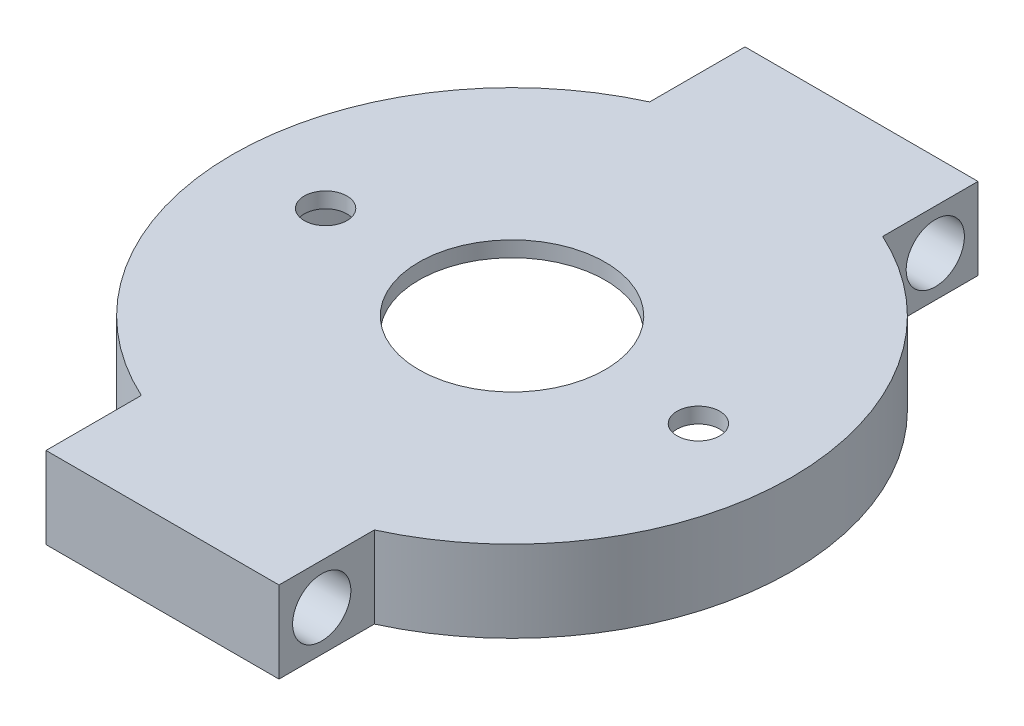
ISO-10303-21;
HEADER;
FILE_DESCRIPTION(('STEP AP214'),'2;1');
FILE_NAME('part.step','',(''),(''),'','','');
FILE_SCHEMA(('AUTOMOTIVE_DESIGN { 1 0 10303 214 1 1 1 1 }'));
ENDSEC;
DATA;
#1=APPLICATION_CONTEXT('core data for automotive mechanical design processes');
#2=APPLICATION_PROTOCOL_DEFINITION('international standard','automotive_design',2000,#1);
#3=PRODUCT_CONTEXT('',#1,'mechanical');
#4=PRODUCT('Part','Part','',(#3));
#5=PRODUCT_RELATED_PRODUCT_CATEGORY('part','',(#4));
#6=PRODUCT_DEFINITION_FORMATION('','',#4);
#7=PRODUCT_DEFINITION_CONTEXT('part definition',#1,'design');
#8=PRODUCT_DEFINITION('design','',#6,#7);
#9=PRODUCT_DEFINITION_SHAPE('','',#8);
#10=(LENGTH_UNIT() NAMED_UNIT(*) SI_UNIT(.MILLI.,.METRE.));
#11=(NAMED_UNIT(*) PLANE_ANGLE_UNIT() SI_UNIT($,.RADIAN.));
#12=(NAMED_UNIT(*) SI_UNIT($,.STERADIAN.) SOLID_ANGLE_UNIT());
#13=UNCERTAINTY_MEASURE_WITH_UNIT(LENGTH_MEASURE(1.E-05),#10,'distance_accuracy_value','');
#14=(GEOMETRIC_REPRESENTATION_CONTEXT(3) GLOBAL_UNCERTAINTY_ASSIGNED_CONTEXT((#13)) GLOBAL_UNIT_ASSIGNED_CONTEXT((#10,
#11,#12)) REPRESENTATION_CONTEXT('',''));
#15=CARTESIAN_POINT('',(0.,0.,0.));
#16=DIRECTION('',(0.,0.,1.));
#17=DIRECTION('',(1.,0.,0.));
#18=AXIS2_PLACEMENT_3D('',#15,#16,#17);
#19=CARTESIAN_POINT('',(0.,13.335,0.));
#20=DIRECTION('',(0.,-1.,0.));
#21=DIRECTION('',(0.,0.,-1.));
#22=AXIS2_PLACEMENT_3D('',#19,#20,#21);
#23=CYLINDRICAL_SURFACE('',#22,39.37);
#24=CARTESIAN_POINT('',(0.,0.,0.));
#25=DIRECTION('',(0.,1.,0.));
#26=DIRECTION('',(0.,0.,1.));
#27=AXIS2_PLACEMENT_3D('',#24,#25,#26);
#28=CIRCLE('',#27,39.37);
#29=CARTESIAN_POINT('',(0.,0.,39.37));
#30=VERTEX_POINT('',#29);
#31=EDGE_CURVE('E148',#30,#30,#28,.T.);
#32=ORIENTED_EDGE('',*,*,#31,.F.);
#33=EDGE_LOOP('',(#32));
#34=FACE_BOUND('',#33,.T.);
#35=CARTESIAN_POINT('',(0.,10.795,0.));
#36=DIRECTION('',(0.,1.,0.));
#37=DIRECTION('',(0.,0.,1.));
#38=AXIS2_PLACEMENT_3D('',#35,#36,#37);
#39=CIRCLE('',#38,39.37);
#40=CARTESIAN_POINT('',(0.,10.795,39.37));
#41=VERTEX_POINT('',#40);
#42=EDGE_CURVE('E199',#41,#41,#39,.T.);
#43=ORIENTED_EDGE('',*,*,#42,.T.);
#44=EDGE_LOOP('',(#43));
#45=FACE_BOUND('',#44,.T.);
#46=ADVANCED_FACE('F35',(#34,#45),#23,.F.);
#47=CARTESIAN_POINT('',(0.,13.335,0.));
#48=DIRECTION('',(0.,-1.,0.));
#49=DIRECTION('',(0.,0.,-1.));
#50=AXIS2_PLACEMENT_3D('',#47,#48,#49);
#51=CYLINDRICAL_SURFACE('',#50,45.72);
#52=CARTESIAN_POINT('',(0.,0.,0.));
#53=DIRECTION('',(0.,1.,0.));
#54=DIRECTION('',(0.,0.,1.));
#55=AXIS2_PLACEMENT_3D('',#52,#53,#54);
#56=CIRCLE('',#55,45.72);
#57=CARTESIAN_POINT('',(19.05,0.,-41.5621931567621));
#58=VERTEX_POINT('',#57);
#59=CARTESIAN_POINT('',(19.05,0.,41.5621931567621));
#60=VERTEX_POINT('',#59);
#61=EDGE_CURVE('E130',#58,#60,#56,.F.);
#62=ORIENTED_EDGE('',*,*,#61,.F.);
#63=DIRECTION('',(0.,-1.,0.));
#64=VECTOR('',#63,1.);
#65=CARTESIAN_POINT('',(19.05,13.335,-41.5621931567621));
#66=LINE('',#65,#64);
#67=CARTESIAN_POINT('',(19.05,13.335,-41.5621931567621));
#68=VERTEX_POINT('',#67);
#69=EDGE_CURVE('E11',#68,#58,#66,.T.);
#70=ORIENTED_EDGE('',*,*,#69,.F.);
#71=CARTESIAN_POINT('',(0.,13.335,0.));
#72=DIRECTION('',(0.,1.,0.));
#73=DIRECTION('',(0.,0.,1.));
#74=AXIS2_PLACEMENT_3D('',#71,#72,#73);
#75=CIRCLE('',#74,45.72);
#76=CARTESIAN_POINT('',(19.05,13.335,41.5621931567621));
#77=VERTEX_POINT('',#76);
#78=EDGE_CURVE('E151',#68,#77,#75,.F.);
#79=ORIENTED_EDGE('',*,*,#78,.T.);
#80=DIRECTION('',(0.,-1.,0.));
#81=VECTOR('',#80,1.);
#82=CARTESIAN_POINT('',(19.05,13.335,41.5621931567621));
#83=LINE('',#82,#81);
#84=EDGE_CURVE('E87',#77,#60,#83,.T.);
#85=ORIENTED_EDGE('',*,*,#84,.T.);
#86=EDGE_LOOP('',(#62,#70,#79,#85));
#87=FACE_BOUND('',#86,.T.);
#88=ADVANCED_FACE('F37',(#87),#51,.T.);
#89=CARTESIAN_POINT('',(19.05,13.335,0.));
#90=DIRECTION('',(1.,0.,0.));
#91=DIRECTION('',(0.,0.,-1.));
#92=AXIS2_PLACEMENT_3D('',#89,#90,#91);
#93=PLANE('',#92);
#94=CARTESIAN_POINT('',(19.05,6.66749999999999,-50.165));
#95=DIRECTION('',(1.,0.,0.));
#96=DIRECTION('',(0.,0.,-1.));
#97=AXIS2_PLACEMENT_3D('',#94,#95,#96);
#98=CIRCLE('',#97,4.7625);
#99=CARTESIAN_POINT('',(19.05,6.66749999999999,-54.9275));
#100=VERTEX_POINT('',#99);
#101=EDGE_CURVE('E193',#100,#100,#98,.T.);
#102=ORIENTED_EDGE('',*,*,#101,.F.);
#103=EDGE_LOOP('',(#102));
#104=FACE_BOUND('',#103,.T.);
#105=DIRECTION('',(0.,0.,1.));
#106=VECTOR('',#105,1.);
#107=CARTESIAN_POINT('',(19.05,0.,0.));
#108=LINE('',#107,#106);
#109=CARTESIAN_POINT('',(19.05,0.,-57.15));
#110=VERTEX_POINT('',#109);
#111=EDGE_CURVE('E133',#110,#58,#108,.T.);
#112=ORIENTED_EDGE('',*,*,#111,.F.);
#113=DIRECTION('',(0.,-1.,0.));
#114=VECTOR('',#113,1.);
#115=CARTESIAN_POINT('',(19.05,13.335,-57.15));
#116=LINE('',#115,#114);
#117=CARTESIAN_POINT('',(19.05,13.335,-57.15));
#118=VERTEX_POINT('',#117);
#119=EDGE_CURVE('E45',#118,#110,#116,.T.);
#120=ORIENTED_EDGE('',*,*,#119,.F.);
#121=DIRECTION('',(0.,0.,1.));
#122=VECTOR('',#121,1.);
#123=CARTESIAN_POINT('',(19.05,13.335,0.));
#124=LINE('',#123,#122);
#125=EDGE_CURVE('E185',#118,#68,#124,.T.);
#126=ORIENTED_EDGE('',*,*,#125,.T.);
#127=ORIENTED_EDGE('',*,*,#69,.T.);
#128=EDGE_LOOP('',(#112,#120,#126,#127));
#129=FACE_BOUND('',#128,.T.);
#130=ADVANCED_FACE('F170',(#104,#129),#93,.T.);
#131=CARTESIAN_POINT('',(0.,13.335,-57.15));
#132=DIRECTION('',(0.,0.,-1.));
#133=DIRECTION('',(-1.,0.,0.));
#134=AXIS2_PLACEMENT_3D('',#131,#132,#133);
#135=PLANE('',#134);
#136=DIRECTION('',(1.,0.,0.));
#137=VECTOR('',#136,1.);
#138=CARTESIAN_POINT('',(0.,0.,-57.15));
#139=LINE('',#138,#137);
#140=CARTESIAN_POINT('',(-19.05,0.,-57.15));
#141=VERTEX_POINT('',#140);
#142=EDGE_CURVE('E136',#141,#110,#139,.T.);
#143=ORIENTED_EDGE('',*,*,#142,.F.);
#144=DIRECTION('',(0.,-1.,0.));
#145=VECTOR('',#144,1.);
#146=CARTESIAN_POINT('',(-19.05,13.335,-57.15));
#147=LINE('',#146,#145);
#148=CARTESIAN_POINT('',(-19.05,13.335,-57.15));
#149=VERTEX_POINT('',#148);
#150=EDGE_CURVE('E158',#149,#141,#147,.T.);
#151=ORIENTED_EDGE('',*,*,#150,.F.);
#152=DIRECTION('',(1.,0.,0.));
#153=VECTOR('',#152,1.);
#154=CARTESIAN_POINT('',(0.,13.335,-57.15));
#155=LINE('',#154,#153);
#156=EDGE_CURVE('E166',#149,#118,#155,.T.);
#157=ORIENTED_EDGE('',*,*,#156,.T.);
#158=ORIENTED_EDGE('',*,*,#119,.T.);
#159=EDGE_LOOP('',(#143,#151,#157,#158));
#160=FACE_BOUND('',#159,.T.);
#161=ADVANCED_FACE('F164',(#160),#135,.T.);
#162=CARTESIAN_POINT('',(-19.0499999999999,13.335,0.));
#163=DIRECTION('',(1.,0.,0.));
#164=DIRECTION('',(0.,0.,-1.));
#165=AXIS2_PLACEMENT_3D('',#162,#163,#164);
#166=PLANE('',#165);
#167=CARTESIAN_POINT('',(-19.05,6.66749999999999,-50.165));
#168=DIRECTION('',(-1.,0.,0.));
#169=DIRECTION('',(0.,0.,1.));
#170=AXIS2_PLACEMENT_3D('',#167,#168,#169);
#171=CIRCLE('',#170,4.7625);
#172=CARTESIAN_POINT('',(-19.05,6.66749999999999,-45.4025));
#173=VERTEX_POINT('',#172);
#174=EDGE_CURVE('E196',#173,#173,#171,.T.);
#175=ORIENTED_EDGE('',*,*,#174,.F.);
#176=EDGE_LOOP('',(#175));
#177=FACE_BOUND('',#176,.T.);
#178=DIRECTION('',(0.,0.,1.));
#179=VECTOR('',#178,1.);
#180=CARTESIAN_POINT('',(-19.0499999999999,0.,0.));
#181=LINE('',#180,#179);
#182=CARTESIAN_POINT('',(-19.05,0.,-41.5621931567621));
#183=VERTEX_POINT('',#182);
#184=EDGE_CURVE('E139',#141,#183,#181,.T.);
#185=ORIENTED_EDGE('',*,*,#184,.T.);
#186=DIRECTION('',(0.,-1.,0.));
#187=VECTOR('',#186,1.);
#188=CARTESIAN_POINT('',(-19.05,13.335,-41.5621931567621));
#189=LINE('',#188,#187);
#190=CARTESIAN_POINT('',(-19.05,13.335,-41.5621931567621));
#191=VERTEX_POINT('',#190);
#192=EDGE_CURVE('E155',#191,#183,#189,.T.);
#193=ORIENTED_EDGE('',*,*,#192,.F.);
#194=DIRECTION('',(0.,0.,1.));
#195=VECTOR('',#194,1.);
#196=CARTESIAN_POINT('',(-19.0499999999999,13.335,0.));
#197=LINE('',#196,#195);
#198=EDGE_CURVE('E125',#149,#191,#197,.T.);
#199=ORIENTED_EDGE('',*,*,#198,.F.);
#200=ORIENTED_EDGE('',*,*,#150,.T.);
#201=EDGE_LOOP('',(#185,#193,#199,#200));
#202=FACE_BOUND('',#201,.T.);
#203=ADVANCED_FACE('F178',(#177,#202),#166,.F.);
#204=CARTESIAN_POINT('',(0.,13.335,0.));
#205=DIRECTION('',(0.,-1.,0.));
#206=DIRECTION('',(0.,0.,-1.));
#207=AXIS2_PLACEMENT_3D('',#204,#205,#206);
#208=CYLINDRICAL_SURFACE('',#207,45.72);
#209=CARTESIAN_POINT('',(0.,0.,0.));
#210=DIRECTION('',(0.,1.,0.));
#211=DIRECTION('',(0.,0.,1.));
#212=AXIS2_PLACEMENT_3D('',#209,#210,#211);
#213=CIRCLE('',#212,45.72);
#214=CARTESIAN_POINT('',(-19.05,0.,41.5621931567621));
#215=VERTEX_POINT('',#214);
#216=EDGE_CURVE('E141',#183,#215,#213,.T.);
#217=ORIENTED_EDGE('',*,*,#216,.T.);
#218=DIRECTION('',(0.,-1.,0.));
#219=VECTOR('',#218,1.);
#220=CARTESIAN_POINT('',(-19.05,13.335,41.5621931567621));
#221=LINE('',#220,#219);
#222=CARTESIAN_POINT('',(-19.05,13.335,41.5621931567621));
#223=VERTEX_POINT('',#222);
#224=EDGE_CURVE('E114',#223,#215,#221,.T.);
#225=ORIENTED_EDGE('',*,*,#224,.F.);
#226=CARTESIAN_POINT('',(0.,13.335,0.));
#227=DIRECTION('',(0.,1.,0.));
#228=DIRECTION('',(0.,0.,1.));
#229=AXIS2_PLACEMENT_3D('',#226,#227,#228);
#230=CIRCLE('',#229,45.72);
#231=EDGE_CURVE('E122',#191,#223,#230,.T.);
#232=ORIENTED_EDGE('',*,*,#231,.F.);
#233=ORIENTED_EDGE('',*,*,#192,.T.);
#234=EDGE_LOOP('',(#217,#225,#232,#233));
#235=FACE_BOUND('',#234,.T.);
#236=ADVANCED_FACE('F181',(#235),#208,.T.);
#237=CARTESIAN_POINT('',(-19.05,13.335,0.));
#238=DIRECTION('',(-1.,0.,0.));
#239=DIRECTION('',(0.,0.,1.));
#240=AXIS2_PLACEMENT_3D('',#237,#238,#239);
#241=PLANE('',#240);
#242=CARTESIAN_POINT('',(-19.05,6.6675,50.165));
#243=DIRECTION('',(-1.,0.,0.));
#244=DIRECTION('',(0.,0.,1.));
#245=AXIS2_PLACEMENT_3D('',#242,#243,#244);
#246=CIRCLE('',#245,4.7625);
#247=CARTESIAN_POINT('',(-19.05,6.6675,54.9275));
#248=VERTEX_POINT('',#247);
#249=EDGE_CURVE('E189',#248,#248,#246,.T.);
#250=ORIENTED_EDGE('',*,*,#249,.F.);
#251=EDGE_LOOP('',(#250));
#252=FACE_BOUND('',#251,.T.);
#253=DIRECTION('',(0.,0.,-1.));
#254=VECTOR('',#253,1.);
#255=CARTESIAN_POINT('',(-19.05,0.,0.));
#256=LINE('',#255,#254);
#257=CARTESIAN_POINT('',(-19.05,0.,57.15));
#258=VERTEX_POINT('',#257);
#259=EDGE_CURVE('E113',#258,#215,#256,.T.);
#260=ORIENTED_EDGE('',*,*,#259,.F.);
#261=DIRECTION('',(0.,-1.,0.));
#262=VECTOR('',#261,1.);
#263=CARTESIAN_POINT('',(-19.05,13.335,57.15));
#264=LINE('',#263,#262);
#265=CARTESIAN_POINT('',(-19.05,13.335,57.15));
#266=VERTEX_POINT('',#265);
#267=EDGE_CURVE('E107',#266,#258,#264,.T.);
#268=ORIENTED_EDGE('',*,*,#267,.F.);
#269=DIRECTION('',(0.,0.,-1.));
#270=VECTOR('',#269,1.);
#271=CARTESIAN_POINT('',(-19.05,13.335,0.));
#272=LINE('',#271,#270);
#273=EDGE_CURVE('E111',#266,#223,#272,.T.);
#274=ORIENTED_EDGE('',*,*,#273,.T.);
#275=ORIENTED_EDGE('',*,*,#224,.T.);
#276=EDGE_LOOP('',(#260,#268,#274,#275));
#277=FACE_BOUND('',#276,.T.);
#278=ADVANCED_FACE('F109',(#252,#277),#241,.T.);
#279=CARTESIAN_POINT('',(0.,13.335,57.15));
#280=DIRECTION('',(0.,0.,-1.));
#281=DIRECTION('',(-1.,0.,0.));
#282=AXIS2_PLACEMENT_3D('',#279,#280,#281);
#283=PLANE('',#282);
#284=DIRECTION('',(1.,0.,0.));
#285=VECTOR('',#284,1.);
#286=CARTESIAN_POINT('',(0.,0.,57.15));
#287=LINE('',#286,#285);
#288=CARTESIAN_POINT('',(19.05,0.,57.15));
#289=VERTEX_POINT('',#288);
#290=EDGE_CURVE('E80',#258,#289,#287,.T.);
#291=ORIENTED_EDGE('',*,*,#290,.T.);
#292=DIRECTION('',(0.,-1.,0.));
#293=VECTOR('',#292,1.);
#294=CARTESIAN_POINT('',(19.05,13.335,57.15));
#295=LINE('',#294,#293);
#296=CARTESIAN_POINT('',(19.05,13.335,57.15));
#297=VERTEX_POINT('',#296);
#298=EDGE_CURVE('E115',#297,#289,#295,.T.);
#299=ORIENTED_EDGE('',*,*,#298,.F.);
#300=DIRECTION('',(1.,0.,0.));
#301=VECTOR('',#300,1.);
#302=CARTESIAN_POINT('',(0.,13.335,57.15));
#303=LINE('',#302,#301);
#304=EDGE_CURVE('E117',#266,#297,#303,.T.);
#305=ORIENTED_EDGE('',*,*,#304,.F.);
#306=ORIENTED_EDGE('',*,*,#267,.T.);
#307=EDGE_LOOP('',(#291,#299,#305,#306));
#308=FACE_BOUND('',#307,.T.);
#309=ADVANCED_FACE('F118',(#308),#283,.F.);
#310=CARTESIAN_POINT('',(19.0499999999999,13.335,0.));
#311=DIRECTION('',(-1.,0.,0.));
#312=DIRECTION('',(0.,0.,1.));
#313=AXIS2_PLACEMENT_3D('',#310,#311,#312);
#314=PLANE('',#313);
#315=CARTESIAN_POINT('',(19.05,6.6675,50.165));
#316=DIRECTION('',(-1.,0.,0.));
#317=DIRECTION('',(0.,0.,1.));
#318=AXIS2_PLACEMENT_3D('',#315,#316,#317);
#319=CIRCLE('',#318,4.7625);
#320=CARTESIAN_POINT('',(19.05,6.6675,54.9275));
#321=VERTEX_POINT('',#320);
#322=EDGE_CURVE('E39',#321,#321,#319,.T.);
#323=ORIENTED_EDGE('',*,*,#322,.T.);
#324=EDGE_LOOP('',(#323));
#325=FACE_BOUND('',#324,.T.);
#326=DIRECTION('',(0.,0.,-1.));
#327=VECTOR('',#326,1.);
#328=CARTESIAN_POINT('',(19.0499999999999,0.,0.));
#329=LINE('',#328,#327);
#330=EDGE_CURVE('E146',#289,#60,#329,.T.);
#331=ORIENTED_EDGE('',*,*,#330,.T.);
#332=ORIENTED_EDGE('',*,*,#84,.F.);
#333=DIRECTION('',(0.,0.,-1.));
#334=VECTOR('',#333,1.);
#335=CARTESIAN_POINT('',(19.0499999999999,13.335,0.));
#336=LINE('',#335,#334);
#337=EDGE_CURVE('E53',#297,#77,#336,.T.);
#338=ORIENTED_EDGE('',*,*,#337,.F.);
#339=ORIENTED_EDGE('',*,*,#298,.T.);
#340=EDGE_LOOP('',(#331,#332,#338,#339));
#341=FACE_BOUND('',#340,.T.);
#342=ADVANCED_FACE('F184',(#325,#341),#314,.F.);
#343=CARTESIAN_POINT('',(0.,13.335,0.));
#344=DIRECTION('',(0.,1.,0.));
#345=DIRECTION('',(0.,0.,1.));
#346=AXIS2_PLACEMENT_3D('',#343,#344,#345);
#347=PLANE('',#346);
#348=CARTESIAN_POINT('',(0.,13.335,0.));
#349=DIRECTION('',(0.,1.,0.));
#350=DIRECTION('',(0.,0.,1.));
#351=AXIS2_PLACEMENT_3D('',#348,#349,#350);
#352=CIRCLE('',#351,15.24);
#353=CARTESIAN_POINT('',(0.,13.335,15.24));
#354=VERTEX_POINT('',#353);
#355=EDGE_CURVE('E215',#354,#354,#352,.T.);
#356=ORIENTED_EDGE('',*,*,#355,.F.);
#357=EDGE_LOOP('',(#356));
#358=FACE_BOUND('',#357,.T.);
#359=CARTESIAN_POINT('',(-30.48,13.335,0.));
#360=DIRECTION('',(0.,1.,0.));
#361=DIRECTION('',(0.,0.,1.));
#362=AXIS2_PLACEMENT_3D('',#359,#360,#361);
#363=CIRCLE('',#362,3.4925);
#364=CARTESIAN_POINT('',(-30.48,13.335,3.4925));
#365=VERTEX_POINT('',#364);
#366=EDGE_CURVE('E209',#365,#365,#363,.T.);
#367=ORIENTED_EDGE('',*,*,#366,.F.);
#368=EDGE_LOOP('',(#367));
#369=FACE_BOUND('',#368,.T.);
#370=CARTESIAN_POINT('',(30.48,13.335,0.));
#371=DIRECTION('',(0.,1.,0.));
#372=DIRECTION('',(0.,0.,1.));
#373=AXIS2_PLACEMENT_3D('',#370,#371,#372);
#374=CIRCLE('',#373,3.4925);
#375=CARTESIAN_POINT('',(30.48,13.335,3.4925));
#376=VERTEX_POINT('',#375);
#377=EDGE_CURVE('E203',#376,#376,#374,.T.);
#378=ORIENTED_EDGE('',*,*,#377,.F.);
#379=EDGE_LOOP('',(#378));
#380=FACE_BOUND('',#379,.T.);
#381=ORIENTED_EDGE('',*,*,#78,.F.);
#382=ORIENTED_EDGE('',*,*,#125,.F.);
#383=ORIENTED_EDGE('',*,*,#156,.F.);
#384=ORIENTED_EDGE('',*,*,#198,.T.);
#385=ORIENTED_EDGE('',*,*,#231,.T.);
#386=ORIENTED_EDGE('',*,*,#273,.F.);
#387=ORIENTED_EDGE('',*,*,#304,.T.);
#388=ORIENTED_EDGE('',*,*,#337,.T.);
#389=EDGE_LOOP('',(#381,#382,#383,#384,#385,#386,#387,#388));
#390=FACE_BOUND('',#389,.T.);
#391=ADVANCED_FACE('F120',(#358,#369,#380,#390),#347,.T.);
#392=CARTESIAN_POINT('',(0.,0.,0.));
#393=DIRECTION('',(0.,1.,0.));
#394=DIRECTION('',(0.,0.,1.));
#395=AXIS2_PLACEMENT_3D('',#392,#393,#394);
#396=PLANE('',#395);
#397=ORIENTED_EDGE('',*,*,#61,.T.);
#398=ORIENTED_EDGE('',*,*,#330,.F.);
#399=ORIENTED_EDGE('',*,*,#290,.F.);
#400=ORIENTED_EDGE('',*,*,#259,.T.);
#401=ORIENTED_EDGE('',*,*,#216,.F.);
#402=ORIENTED_EDGE('',*,*,#184,.F.);
#403=ORIENTED_EDGE('',*,*,#142,.T.);
#404=ORIENTED_EDGE('',*,*,#111,.T.);
#405=EDGE_LOOP('',(#397,#398,#399,#400,#401,#402,#403,#404));
#406=FACE_BOUND('',#405,.T.);
#407=ORIENTED_EDGE('',*,*,#31,.T.);
#408=EDGE_LOOP('',(#407));
#409=FACE_BOUND('',#408,.T.);
#410=ADVANCED_FACE('F173',(#406,#409),#396,.F.);
#411=CARTESIAN_POINT('',(45.72,6.6675,50.165));
#412=DIRECTION('',(-1.,0.,0.));
#413=DIRECTION('',(0.,0.,1.));
#414=AXIS2_PLACEMENT_3D('',#411,#412,#413);
#415=CYLINDRICAL_SURFACE('',#414,4.7625);
#416=ORIENTED_EDGE('',*,*,#249,.T.);
#417=EDGE_LOOP('',(#416));
#418=FACE_BOUND('',#417,.T.);
#419=ORIENTED_EDGE('',*,*,#322,.F.);
#420=EDGE_LOOP('',(#419));
#421=FACE_BOUND('',#420,.T.);
#422=ADVANCED_FACE('F283',(#418,#421),#415,.F.);
#423=CARTESIAN_POINT('',(45.72,6.66749999999999,-50.165));
#424=DIRECTION('',(-1.,0.,0.));
#425=DIRECTION('',(0.,0.,1.));
#426=AXIS2_PLACEMENT_3D('',#423,#424,#425);
#427=CYLINDRICAL_SURFACE('',#426,4.7625);
#428=ORIENTED_EDGE('',*,*,#101,.T.);
#429=EDGE_LOOP('',(#428));
#430=FACE_BOUND('',#429,.T.);
#431=ORIENTED_EDGE('',*,*,#174,.T.);
#432=EDGE_LOOP('',(#431));
#433=FACE_BOUND('',#432,.T.);
#434=ADVANCED_FACE('F248',(#430,#433),#427,.F.);
#435=CARTESIAN_POINT('',(0.,10.795,0.));
#436=DIRECTION('',(0.,1.,0.));
#437=DIRECTION('',(0.,0.,1.));
#438=AXIS2_PLACEMENT_3D('',#435,#436,#437);
#439=PLANE('',#438);
#440=CARTESIAN_POINT('',(0.,10.795,0.));
#441=DIRECTION('',(0.,1.,0.));
#442=DIRECTION('',(0.,0.,1.));
#443=AXIS2_PLACEMENT_3D('',#440,#441,#442);
#444=CIRCLE('',#443,15.24);
#445=CARTESIAN_POINT('',(0.,10.795,15.24));
#446=VERTEX_POINT('',#445);
#447=EDGE_CURVE('E212',#446,#446,#444,.T.);
#448=ORIENTED_EDGE('',*,*,#447,.T.);
#449=EDGE_LOOP('',(#448));
#450=FACE_BOUND('',#449,.T.);
#451=CARTESIAN_POINT('',(-30.48,10.795,0.));
#452=DIRECTION('',(0.,1.,0.));
#453=DIRECTION('',(0.,0.,1.));
#454=AXIS2_PLACEMENT_3D('',#451,#452,#453);
#455=CIRCLE('',#454,3.4925);
#456=CARTESIAN_POINT('',(-30.48,10.795,3.4925));
#457=VERTEX_POINT('',#456);
#458=EDGE_CURVE('E206',#457,#457,#455,.T.);
#459=ORIENTED_EDGE('',*,*,#458,.T.);
#460=EDGE_LOOP('',(#459));
#461=FACE_BOUND('',#460,.T.);
#462=CARTESIAN_POINT('',(30.48,10.795,0.));
#463=DIRECTION('',(0.,1.,0.));
#464=DIRECTION('',(0.,0.,1.));
#465=AXIS2_PLACEMENT_3D('',#462,#463,#464);
#466=CIRCLE('',#465,3.4925);
#467=CARTESIAN_POINT('',(30.48,10.795,3.4925));
#468=VERTEX_POINT('',#467);
#469=EDGE_CURVE('E202',#468,#468,#466,.T.);
#470=ORIENTED_EDGE('',*,*,#469,.T.);
#471=EDGE_LOOP('',(#470));
#472=FACE_BOUND('',#471,.T.);
#473=ORIENTED_EDGE('',*,*,#42,.F.);
#474=EDGE_LOOP('',(#473));
#475=FACE_BOUND('',#474,.T.);
#476=ADVANCED_FACE('F221',(#450,#461,#472,#475),#439,.F.);
#477=CARTESIAN_POINT('',(30.48,10.795,0.));
#478=DIRECTION('',(0.,1.,0.));
#479=DIRECTION('',(0.,0.,1.));
#480=AXIS2_PLACEMENT_3D('',#477,#478,#479);
#481=CYLINDRICAL_SURFACE('',#480,3.4925);
#482=ORIENTED_EDGE('',*,*,#469,.F.);
#483=EDGE_LOOP('',(#482));
#484=FACE_BOUND('',#483,.T.);
#485=ORIENTED_EDGE('',*,*,#377,.T.);
#486=EDGE_LOOP('',(#485));
#487=FACE_BOUND('',#486,.T.);
#488=ADVANCED_FACE('F238',(#484,#487),#481,.F.);
#489=CARTESIAN_POINT('',(-30.48,10.795,0.));
#490=DIRECTION('',(0.,1.,0.));
#491=DIRECTION('',(0.,0.,1.));
#492=AXIS2_PLACEMENT_3D('',#489,#490,#491);
#493=CYLINDRICAL_SURFACE('',#492,3.4925);
#494=ORIENTED_EDGE('',*,*,#458,.F.);
#495=EDGE_LOOP('',(#494));
#496=FACE_BOUND('',#495,.T.);
#497=ORIENTED_EDGE('',*,*,#366,.T.);
#498=EDGE_LOOP('',(#497));
#499=FACE_BOUND('',#498,.T.);
#500=ADVANCED_FACE('F227',(#496,#499),#493,.F.);
#501=CARTESIAN_POINT('',(0.,10.795,0.));
#502=DIRECTION('',(0.,1.,0.));
#503=DIRECTION('',(0.,0.,1.));
#504=AXIS2_PLACEMENT_3D('',#501,#502,#503);
#505=CYLINDRICAL_SURFACE('',#504,15.24);
#506=ORIENTED_EDGE('',*,*,#447,.F.);
#507=EDGE_LOOP('',(#506));
#508=FACE_BOUND('',#507,.T.);
#509=ORIENTED_EDGE('',*,*,#355,.T.);
#510=EDGE_LOOP('',(#509));
#511=FACE_BOUND('',#510,.T.);
#512=ADVANCED_FACE('F224',(#508,#511),#505,.F.);
#513=CLOSED_SHELL('',(#46,#88,#130,#161,#203,#236,#278,#309,#342,#391,#410,#422,#434,#476,#488,
#500,#512));
#514=MANIFOLD_SOLID_BREP('B2',#513);
#515=ADVANCED_BREP_SHAPE_REPRESENTATION('',(#18,#514),#14);
#516=SHAPE_DEFINITION_REPRESENTATION(#9,#515);
ENDSEC;
END-ISO-10303-21;
